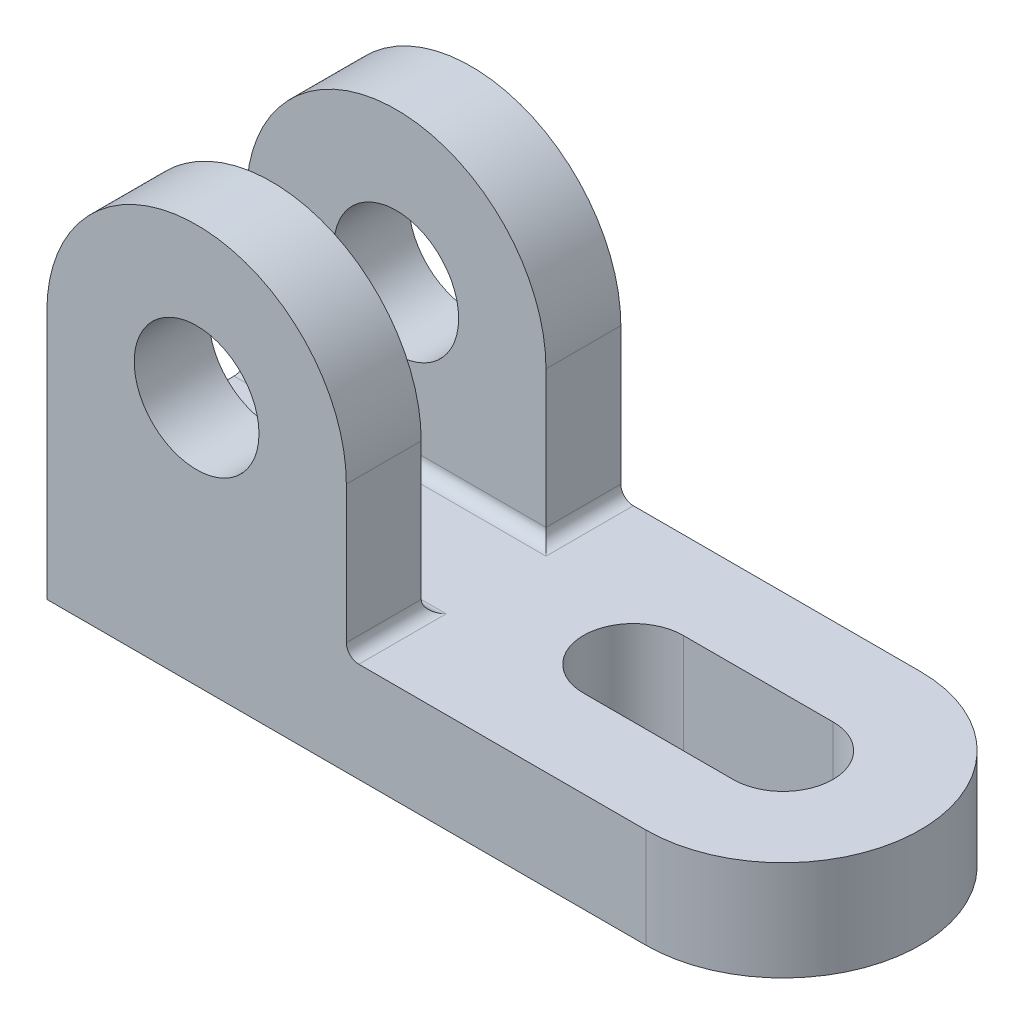
ISO-10303-21;
HEADER;
FILE_DESCRIPTION(('STEP AP214'),'2;1');
FILE_NAME('part.step','',(''),(''),'','','');
FILE_SCHEMA(('AUTOMOTIVE_DESIGN { 1 0 10303 214 1 1 1 1 }'));
ENDSEC;
DATA;
#1=APPLICATION_CONTEXT('core data for automotive mechanical design processes');
#2=APPLICATION_PROTOCOL_DEFINITION('international standard','automotive_design',2000,#1);
#3=PRODUCT_CONTEXT('',#1,'mechanical');
#4=PRODUCT('Part','Part','',(#3));
#5=PRODUCT_RELATED_PRODUCT_CATEGORY('part','',(#4));
#6=PRODUCT_DEFINITION_FORMATION('','',#4);
#7=PRODUCT_DEFINITION_CONTEXT('part definition',#1,'design');
#8=PRODUCT_DEFINITION('design','',#6,#7);
#9=PRODUCT_DEFINITION_SHAPE('','',#8);
#10=(LENGTH_UNIT() NAMED_UNIT(*) SI_UNIT(.MILLI.,.METRE.));
#11=(NAMED_UNIT(*) PLANE_ANGLE_UNIT() SI_UNIT($,.RADIAN.));
#12=(NAMED_UNIT(*) SI_UNIT($,.STERADIAN.) SOLID_ANGLE_UNIT());
#13=UNCERTAINTY_MEASURE_WITH_UNIT(LENGTH_MEASURE(1.E-05),#10,'distance_accuracy_value','');
#14=(GEOMETRIC_REPRESENTATION_CONTEXT(3) GLOBAL_UNCERTAINTY_ASSIGNED_CONTEXT((#13)) GLOBAL_UNIT_ASSIGNED_CONTEXT((#10,
#11,#12)) REPRESENTATION_CONTEXT('',''));
#15=CARTESIAN_POINT('',(0.,0.,0.));
#16=DIRECTION('',(0.,0.,1.));
#17=DIRECTION('',(1.,0.,0.));
#18=AXIS2_PLACEMENT_3D('',#15,#16,#17);
#19=CARTESIAN_POINT('',(0.,16.,0.));
#20=DIRECTION('',(0.,1.,0.));
#21=DIRECTION('',(0.,0.,1.));
#22=AXIS2_PLACEMENT_3D('',#19,#20,#21);
#23=PLANE('',#22);
#24=CARTESIAN_POINT('',(37.,16.,0.));
#25=DIRECTION('',(0.,1.,0.));
#26=DIRECTION('',(0.,0.,1.));
#27=AXIS2_PLACEMENT_3D('',#24,#25,#26);
#28=CIRCLE('',#27,8.);
#29=CARTESIAN_POINT('',(37.,16.,8.));
#30=VERTEX_POINT('',#29);
#31=CARTESIAN_POINT('',(37.,16.,-8.));
#32=VERTEX_POINT('',#31);
#33=EDGE_CURVE('E199',#30,#32,#28,.T.);
#34=ORIENTED_EDGE('',*,*,#33,.F.);
#35=DIRECTION('',(1.,0.,0.));
#36=VECTOR('',#35,1.);
#37=CARTESIAN_POINT('',(37.,16.,8.));
#38=LINE('',#37,#36);
#39=CARTESIAN_POINT('',(13.,16.,8.00000000000001));
#40=VERTEX_POINT('',#39);
#41=EDGE_CURVE('E207',#40,#30,#38,.T.);
#42=ORIENTED_EDGE('',*,*,#41,.F.);
#43=CARTESIAN_POINT('',(13.,16.,0.));
#44=DIRECTION('',(0.,1.,0.));
#45=DIRECTION('',(0.,0.,1.));
#46=AXIS2_PLACEMENT_3D('',#43,#44,#45);
#47=CIRCLE('',#46,8.);
#48=CARTESIAN_POINT('',(13.,16.,-8.));
#49=VERTEX_POINT('',#48);
#50=EDGE_CURVE('E221',#49,#40,#47,.T.);
#51=ORIENTED_EDGE('',*,*,#50,.F.);
#52=DIRECTION('',(-1.,0.,0.));
#53=VECTOR('',#52,1.);
#54=CARTESIAN_POINT('',(37.,16.,-8.));
#55=LINE('',#54,#53);
#56=EDGE_CURVE('E218',#32,#49,#55,.T.);
#57=ORIENTED_EDGE('',*,*,#56,.F.);
#58=EDGE_LOOP('',(#34,#42,#51,#57));
#59=FACE_BOUND('',#58,.T.);
#60=DIRECTION('',(0.,0.,-1.));
#61=VECTOR('',#60,1.);
#62=CARTESIAN_POINT('',(-8.99999999999998,16.,0.));
#63=LINE('',#62,#61);
#64=CARTESIAN_POINT('',(-8.99999999999998,16.,-22.));
#65=VERTEX_POINT('',#64);
#66=CARTESIAN_POINT('',(-8.99999999999998,16.,-8.));
#67=VERTEX_POINT('',#66);
#68=EDGE_CURVE('E246',#65,#67,#63,.F.);
#69=ORIENTED_EDGE('',*,*,#68,.T.);
#70=DIRECTION('',(-1.,0.,0.));
#71=VECTOR('',#70,1.);
#72=CARTESIAN_POINT('',(0.,16.,-8.));
#73=LINE('',#72,#71);
#74=CARTESIAN_POINT('',(-59.,16.,-8.));
#75=VERTEX_POINT('',#74);
#76=EDGE_CURVE('E286',#67,#75,#73,.T.);
#77=ORIENTED_EDGE('',*,*,#76,.T.);
#78=DIRECTION('',(0.,0.,-1.));
#79=VECTOR('',#78,1.);
#80=CARTESIAN_POINT('',(-59.,16.,0.));
#81=LINE('',#80,#79);
#82=CARTESIAN_POINT('',(-59.,16.,8.));
#83=VERTEX_POINT('',#82);
#84=EDGE_CURVE('E265',#83,#75,#81,.T.);
#85=ORIENTED_EDGE('',*,*,#84,.F.);
#86=DIRECTION('',(-1.,0.,0.));
#87=VECTOR('',#86,1.);
#88=CARTESIAN_POINT('',(0.,16.,8.));
#89=LINE('',#88,#87);
#90=CARTESIAN_POINT('',(-8.99999999999998,16.,8.));
#91=VERTEX_POINT('',#90);
#92=EDGE_CURVE('E283',#83,#91,#89,.F.);
#93=ORIENTED_EDGE('',*,*,#92,.T.);
#94=DIRECTION('',(0.,0.,1.));
#95=VECTOR('',#94,1.);
#96=CARTESIAN_POINT('',(-8.99999999999998,16.,22.));
#97=LINE('',#96,#95);
#98=CARTESIAN_POINT('',(-8.99999999999998,16.,22.));
#99=VERTEX_POINT('',#98);
#100=EDGE_CURVE('E248',#91,#99,#97,.T.);
#101=ORIENTED_EDGE('',*,*,#100,.T.);
#102=DIRECTION('',(1.,0.,0.));
#103=VECTOR('',#102,1.);
#104=CARTESIAN_POINT('',(0.,16.,22.));
#105=LINE('',#104,#103);
#106=CARTESIAN_POINT('',(37.,16.,22.));
#107=VERTEX_POINT('',#106);
#108=EDGE_CURVE('E240',#99,#107,#105,.T.);
#109=ORIENTED_EDGE('',*,*,#108,.T.);
#110=CARTESIAN_POINT('',(37.,16.,0.));
#111=DIRECTION('',(0.,1.,0.));
#112=DIRECTION('',(0.,0.,1.));
#113=AXIS2_PLACEMENT_3D('',#110,#111,#112);
#114=CIRCLE('',#113,22.);
#115=CARTESIAN_POINT('',(37.,16.,-22.));
#116=VERTEX_POINT('',#115);
#117=EDGE_CURVE('E237',#107,#116,#114,.T.);
#118=ORIENTED_EDGE('',*,*,#117,.T.);
#119=DIRECTION('',(1.,0.,0.));
#120=VECTOR('',#119,1.);
#121=CARTESIAN_POINT('',(0.,16.,-22.));
#122=LINE('',#121,#120);
#123=EDGE_CURVE('E277',#65,#116,#122,.T.);
#124=ORIENTED_EDGE('',*,*,#123,.F.);
#125=EDGE_LOOP('',(#69,#77,#85,#93,#101,#109,#118,#124));
#126=FACE_BOUND('',#125,.T.);
#127=ADVANCED_FACE('F35',(#59,#126),#23,.T.);
#128=CARTESIAN_POINT('',(0.,16.,22.));
#129=DIRECTION('',(0.,0.,-1.));
#130=DIRECTION('',(-1.,0.,0.));
#131=AXIS2_PLACEMENT_3D('',#128,#129,#130);
#132=PLANE('',#131);
#133=DIRECTION('',(1.,0.,0.));
#134=VECTOR('',#133,1.);
#135=CARTESIAN_POINT('',(0.,0.,22.));
#136=LINE('',#135,#134);
#137=CARTESIAN_POINT('',(-59.,0.,22.));
#138=VERTEX_POINT('',#137);
#139=CARTESIAN_POINT('',(37.,0.,22.));
#140=VERTEX_POINT('',#139);
#141=EDGE_CURVE('E228',#138,#140,#136,.T.);
#142=ORIENTED_EDGE('',*,*,#141,.T.);
#143=DIRECTION('',(0.,-1.,0.));
#144=VECTOR('',#143,1.);
#145=CARTESIAN_POINT('',(37.,16.,22.));
#146=LINE('',#145,#144);
#147=EDGE_CURVE('E249',#107,#140,#146,.T.);
#148=ORIENTED_EDGE('',*,*,#147,.F.);
#149=ORIENTED_EDGE('',*,*,#108,.F.);
#150=CARTESIAN_POINT('',(-8.99999999999998,18.,22.));
#151=DIRECTION('',(0.,0.,-1.));
#152=DIRECTION('',(-1.,0.,0.));
#153=AXIS2_PLACEMENT_3D('',#150,#151,#152);
#154=CIRCLE('',#153,2.);
#155=CARTESIAN_POINT('',(-11.,18.,22.));
#156=VERTEX_POINT('',#155);
#157=EDGE_CURVE('E324',#99,#156,#154,.T.);
#158=ORIENTED_EDGE('',*,*,#157,.T.);
#159=DIRECTION('',(0.,1.,0.));
#160=VECTOR('',#159,1.);
#161=CARTESIAN_POINT('',(-11.,0.,22.));
#162=LINE('',#161,#160);
#163=CARTESIAN_POINT('',(-11.,40.,22.));
#164=VERTEX_POINT('',#163);
#165=EDGE_CURVE('E193',#156,#164,#162,.T.);
#166=ORIENTED_EDGE('',*,*,#165,.T.);
#167=CARTESIAN_POINT('',(-35.,40.,22.));
#168=DIRECTION('',(0.,0.,1.));
#169=DIRECTION('',(1.,0.,0.));
#170=AXIS2_PLACEMENT_3D('',#167,#168,#169);
#171=CIRCLE('',#170,24.);
#172=CARTESIAN_POINT('',(-59.,40.,22.));
#173=VERTEX_POINT('',#172);
#174=EDGE_CURVE('E185',#164,#173,#171,.T.);
#175=ORIENTED_EDGE('',*,*,#174,.T.);
#176=DIRECTION('',(0.,-1.,0.));
#177=VECTOR('',#176,1.);
#178=CARTESIAN_POINT('',(-59.,16.,22.));
#179=LINE('',#178,#177);
#180=EDGE_CURVE('E263',#173,#138,#179,.T.);
#181=ORIENTED_EDGE('',*,*,#180,.T.);
#182=EDGE_LOOP('',(#142,#148,#149,#158,#166,#175,#181));
#183=FACE_BOUND('',#182,.T.);
#184=CARTESIAN_POINT('',(-35.,40.,22.));
#185=DIRECTION('',(0.,0.,1.));
#186=DIRECTION('',(1.,0.,0.));
#187=AXIS2_PLACEMENT_3D('',#184,#185,#186);
#188=CIRCLE('',#187,10.);
#189=CARTESIAN_POINT('',(-25.,40.,22.));
#190=VERTEX_POINT('',#189);
#191=EDGE_CURVE('E176',#190,#190,#188,.T.);
#192=ORIENTED_EDGE('',*,*,#191,.F.);
#193=EDGE_LOOP('',(#192));
#194=FACE_BOUND('',#193,.T.);
#195=ADVANCED_FACE('F320',(#183,#194),#132,.F.);
#196=CARTESIAN_POINT('',(37.,16.,0.));
#197=DIRECTION('',(0.,-1.,0.));
#198=DIRECTION('',(0.,0.,-1.));
#199=AXIS2_PLACEMENT_3D('',#196,#197,#198);
#200=CYLINDRICAL_SURFACE('',#199,22.);
#201=CARTESIAN_POINT('',(37.,0.,0.));
#202=DIRECTION('',(0.,1.,0.));
#203=DIRECTION('',(0.,0.,1.));
#204=AXIS2_PLACEMENT_3D('',#201,#202,#203);
#205=CIRCLE('',#204,22.);
#206=CARTESIAN_POINT('',(37.,0.,-22.));
#207=VERTEX_POINT('',#206);
#208=EDGE_CURVE('E271',#140,#207,#205,.T.);
#209=ORIENTED_EDGE('',*,*,#208,.T.);
#210=DIRECTION('',(0.,-1.,0.));
#211=VECTOR('',#210,1.);
#212=CARTESIAN_POINT('',(37.,16.,-22.));
#213=LINE('',#212,#211);
#214=EDGE_CURVE('E259',#116,#207,#213,.T.);
#215=ORIENTED_EDGE('',*,*,#214,.F.);
#216=ORIENTED_EDGE('',*,*,#117,.F.);
#217=ORIENTED_EDGE('',*,*,#147,.T.);
#218=EDGE_LOOP('',(#209,#215,#216,#217));
#219=FACE_BOUND('',#218,.T.);
#220=ADVANCED_FACE('F365',(#219),#200,.T.);
#221=CARTESIAN_POINT('',(0.,16.,-22.));
#222=DIRECTION('',(0.,0.,-1.));
#223=DIRECTION('',(-1.,0.,0.));
#224=AXIS2_PLACEMENT_3D('',#221,#222,#223);
#225=PLANE('',#224);
#226=DIRECTION('',(1.,0.,0.));
#227=VECTOR('',#226,1.);
#228=CARTESIAN_POINT('',(0.,0.,-22.));
#229=LINE('',#228,#227);
#230=CARTESIAN_POINT('',(-59.,0.,-22.));
#231=VERTEX_POINT('',#230);
#232=EDGE_CURVE('E268',#231,#207,#229,.T.);
#233=ORIENTED_EDGE('',*,*,#232,.F.);
#234=DIRECTION('',(0.,-1.,0.));
#235=VECTOR('',#234,1.);
#236=CARTESIAN_POINT('',(-59.,16.,-22.));
#237=LINE('',#236,#235);
#238=CARTESIAN_POINT('',(-59.,40.,-22.));
#239=VERTEX_POINT('',#238);
#240=EDGE_CURVE('E261',#239,#231,#237,.T.);
#241=ORIENTED_EDGE('',*,*,#240,.F.);
#242=CARTESIAN_POINT('',(-35.,40.,-22.));
#243=DIRECTION('',(0.,0.,1.));
#244=DIRECTION('',(1.,0.,0.));
#245=AXIS2_PLACEMENT_3D('',#242,#243,#244);
#246=CIRCLE('',#245,24.);
#247=CARTESIAN_POINT('',(-11.,40.,-22.));
#248=VERTEX_POINT('',#247);
#249=EDGE_CURVE('E173',#248,#239,#246,.T.);
#250=ORIENTED_EDGE('',*,*,#249,.F.);
#251=DIRECTION('',(0.,1.,0.));
#252=VECTOR('',#251,1.);
#253=CARTESIAN_POINT('',(-11.,0.,-22.));
#254=LINE('',#253,#252);
#255=CARTESIAN_POINT('',(-11.,18.,-22.));
#256=VERTEX_POINT('',#255);
#257=EDGE_CURVE('E331',#256,#248,#254,.T.);
#258=ORIENTED_EDGE('',*,*,#257,.F.);
#259=CARTESIAN_POINT('',(-8.99999999999998,18.,-22.));
#260=DIRECTION('',(0.,0.,-1.));
#261=DIRECTION('',(-1.,0.,0.));
#262=AXIS2_PLACEMENT_3D('',#259,#260,#261);
#263=CIRCLE('',#262,2.);
#264=EDGE_CURVE('E281',#256,#65,#263,.F.);
#265=ORIENTED_EDGE('',*,*,#264,.T.);
#266=ORIENTED_EDGE('',*,*,#123,.T.);
#267=ORIENTED_EDGE('',*,*,#214,.T.);
#268=EDGE_LOOP('',(#233,#241,#250,#258,#265,#266,#267));
#269=FACE_BOUND('',#268,.T.);
#270=CARTESIAN_POINT('',(-35.,40.,-22.));
#271=DIRECTION('',(0.,0.,1.));
#272=DIRECTION('',(1.,0.,0.));
#273=AXIS2_PLACEMENT_3D('',#270,#271,#272);
#274=CIRCLE('',#273,10.);
#275=CARTESIAN_POINT('',(-25.,40.,-22.));
#276=VERTEX_POINT('',#275);
#277=EDGE_CURVE('E341',#276,#276,#274,.T.);
#278=ORIENTED_EDGE('',*,*,#277,.T.);
#279=EDGE_LOOP('',(#278));
#280=FACE_BOUND('',#279,.T.);
#281=ADVANCED_FACE('F336',(#269,#280),#225,.T.);
#282=CARTESIAN_POINT('',(-59.,16.,0.));
#283=DIRECTION('',(-1.,0.,0.));
#284=DIRECTION('',(0.,0.,1.));
#285=AXIS2_PLACEMENT_3D('',#282,#283,#284);
#286=PLANE('',#285);
#287=DIRECTION('',(0.,0.,-1.));
#288=VECTOR('',#287,1.);
#289=CARTESIAN_POINT('',(-59.,0.,0.));
#290=LINE('',#289,#288);
#291=EDGE_CURVE('E243',#138,#231,#290,.T.);
#292=ORIENTED_EDGE('',*,*,#291,.F.);
#293=ORIENTED_EDGE('',*,*,#180,.F.);
#294=DIRECTION('',(0.,0.,1.));
#295=VECTOR('',#294,1.);
#296=CARTESIAN_POINT('',(-59.,40.,10.));
#297=LINE('',#296,#295);
#298=CARTESIAN_POINT('',(-59.,40.,10.));
#299=VERTEX_POINT('',#298);
#300=EDGE_CURVE('E196',#299,#173,#297,.T.);
#301=ORIENTED_EDGE('',*,*,#300,.F.);
#302=DIRECTION('',(0.,1.,0.));
#303=VECTOR('',#302,1.);
#304=CARTESIAN_POINT('',(-59.,0.,10.));
#305=LINE('',#304,#303);
#306=CARTESIAN_POINT('',(-59.,18.,10.));
#307=VERTEX_POINT('',#306);
#308=EDGE_CURVE('E190',#307,#299,#305,.T.);
#309=ORIENTED_EDGE('',*,*,#308,.F.);
#310=CARTESIAN_POINT('',(-59.,18.,8.));
#311=DIRECTION('',(-1.,0.,0.));
#312=DIRECTION('',(0.,0.,1.));
#313=AXIS2_PLACEMENT_3D('',#310,#311,#312);
#314=CIRCLE('',#313,2.);
#315=EDGE_CURVE('E43',#307,#83,#314,.F.);
#316=ORIENTED_EDGE('',*,*,#315,.T.);
#317=ORIENTED_EDGE('',*,*,#84,.T.);
#318=CARTESIAN_POINT('',(-59.,18.,-8.));
#319=DIRECTION('',(-1.,0.,0.));
#320=DIRECTION('',(0.,0.,1.));
#321=AXIS2_PLACEMENT_3D('',#318,#319,#320);
#322=CIRCLE('',#321,2.);
#323=CARTESIAN_POINT('',(-59.,18.,-10.));
#324=VERTEX_POINT('',#323);
#325=EDGE_CURVE('E57',#75,#324,#322,.F.);
#326=ORIENTED_EDGE('',*,*,#325,.T.);
#327=DIRECTION('',(0.,1.,0.));
#328=VECTOR('',#327,1.);
#329=CARTESIAN_POINT('',(-59.,0.,-10.));
#330=LINE('',#329,#328);
#331=CARTESIAN_POINT('',(-59.,40.,-10.));
#332=VERTEX_POINT('',#331);
#333=EDGE_CURVE('E151',#324,#332,#330,.T.);
#334=ORIENTED_EDGE('',*,*,#333,.T.);
#335=DIRECTION('',(0.,0.,-1.));
#336=VECTOR('',#335,1.);
#337=CARTESIAN_POINT('',(-59.,40.,-10.));
#338=LINE('',#337,#336);
#339=EDGE_CURVE('E156',#332,#239,#338,.T.);
#340=ORIENTED_EDGE('',*,*,#339,.T.);
#341=ORIENTED_EDGE('',*,*,#240,.T.);
#342=EDGE_LOOP('',(#292,#293,#301,#309,#316,#317,#326,#334,#340,#341));
#343=FACE_BOUND('',#342,.T.);
#344=ADVANCED_FACE('F154',(#343),#286,.T.);
#345=CARTESIAN_POINT('',(0.,0.,0.));
#346=DIRECTION('',(0.,1.,0.));
#347=DIRECTION('',(0.,0.,1.));
#348=AXIS2_PLACEMENT_3D('',#345,#346,#347);
#349=PLANE('',#348);
#350=DIRECTION('',(1.,0.,0.));
#351=VECTOR('',#350,1.);
#352=CARTESIAN_POINT('',(37.,0.,8.));
#353=LINE('',#352,#351);
#354=CARTESIAN_POINT('',(13.,0.,8.00000000000001));
#355=VERTEX_POINT('',#354);
#356=CARTESIAN_POINT('',(37.,0.,8.));
#357=VERTEX_POINT('',#356);
#358=EDGE_CURVE('E213',#355,#357,#353,.T.);
#359=ORIENTED_EDGE('',*,*,#358,.T.);
#360=CARTESIAN_POINT('',(37.,0.,0.));
#361=DIRECTION('',(0.,1.,0.));
#362=DIRECTION('',(0.,0.,1.));
#363=AXIS2_PLACEMENT_3D('',#360,#361,#362);
#364=CIRCLE('',#363,8.);
#365=CARTESIAN_POINT('',(37.,0.,-8.));
#366=VERTEX_POINT('',#365);
#367=EDGE_CURVE('E203',#357,#366,#364,.T.);
#368=ORIENTED_EDGE('',*,*,#367,.T.);
#369=DIRECTION('',(-1.,0.,0.));
#370=VECTOR('',#369,1.);
#371=CARTESIAN_POINT('',(37.,0.,-8.));
#372=LINE('',#371,#370);
#373=CARTESIAN_POINT('',(13.,0.,-8.));
#374=VERTEX_POINT('',#373);
#375=EDGE_CURVE('E206',#366,#374,#372,.T.);
#376=ORIENTED_EDGE('',*,*,#375,.T.);
#377=CARTESIAN_POINT('',(13.,0.,0.));
#378=DIRECTION('',(0.,1.,0.));
#379=DIRECTION('',(0.,0.,1.));
#380=AXIS2_PLACEMENT_3D('',#377,#378,#379);
#381=CIRCLE('',#380,8.);
#382=EDGE_CURVE('E210',#374,#355,#381,.T.);
#383=ORIENTED_EDGE('',*,*,#382,.T.);
#384=EDGE_LOOP('',(#359,#368,#376,#383));
#385=FACE_BOUND('',#384,.T.);
#386=ORIENTED_EDGE('',*,*,#141,.F.);
#387=ORIENTED_EDGE('',*,*,#291,.T.);
#388=ORIENTED_EDGE('',*,*,#232,.T.);
#389=ORIENTED_EDGE('',*,*,#208,.F.);
#390=EDGE_LOOP('',(#386,#387,#388,#389));
#391=FACE_BOUND('',#390,.T.);
#392=ADVANCED_FACE('F372',(#385,#391),#349,.F.);
#393=CARTESIAN_POINT('',(37.,0.,0.));
#394=DIRECTION('',(0.,1.,0.));
#395=DIRECTION('',(0.,0.,1.));
#396=AXIS2_PLACEMENT_3D('',#393,#394,#395);
#397=CYLINDRICAL_SURFACE('',#396,8.);
#398=ORIENTED_EDGE('',*,*,#33,.T.);
#399=DIRECTION('',(0.,1.,0.));
#400=VECTOR('',#399,1.);
#401=CARTESIAN_POINT('',(37.,0.,-8.));
#402=LINE('',#401,#400);
#403=EDGE_CURVE('E216',#366,#32,#402,.T.);
#404=ORIENTED_EDGE('',*,*,#403,.F.);
#405=ORIENTED_EDGE('',*,*,#367,.F.);
#406=DIRECTION('',(0.,1.,0.));
#407=VECTOR('',#406,1.);
#408=CARTESIAN_POINT('',(37.,0.,8.));
#409=LINE('',#408,#407);
#410=EDGE_CURVE('E226',#357,#30,#409,.T.);
#411=ORIENTED_EDGE('',*,*,#410,.T.);
#412=EDGE_LOOP('',(#398,#404,#405,#411));
#413=FACE_BOUND('',#412,.T.);
#414=ADVANCED_FACE('F370',(#413),#397,.F.);
#415=CARTESIAN_POINT('',(37.,0.,8.));
#416=DIRECTION('',(0.,0.,1.));
#417=DIRECTION('',(1.,0.,0.));
#418=AXIS2_PLACEMENT_3D('',#415,#416,#417);
#419=PLANE('',#418);
#420=ORIENTED_EDGE('',*,*,#41,.T.);
#421=ORIENTED_EDGE('',*,*,#410,.F.);
#422=ORIENTED_EDGE('',*,*,#358,.F.);
#423=DIRECTION('',(0.,1.,0.));
#424=VECTOR('',#423,1.);
#425=CARTESIAN_POINT('',(13.,0.,8.00000000000001));
#426=LINE('',#425,#424);
#427=EDGE_CURVE('E229',#355,#40,#426,.T.);
#428=ORIENTED_EDGE('',*,*,#427,.T.);
#429=EDGE_LOOP('',(#420,#421,#422,#428));
#430=FACE_BOUND('',#429,.T.);
#431=ADVANCED_FACE('F525',(#430),#419,.F.);
#432=CARTESIAN_POINT('',(13.,0.,0.));
#433=DIRECTION('',(0.,1.,0.));
#434=DIRECTION('',(0.,0.,1.));
#435=AXIS2_PLACEMENT_3D('',#432,#433,#434);
#436=CYLINDRICAL_SURFACE('',#435,8.);
#437=ORIENTED_EDGE('',*,*,#50,.T.);
#438=ORIENTED_EDGE('',*,*,#427,.F.);
#439=ORIENTED_EDGE('',*,*,#382,.F.);
#440=DIRECTION('',(0.,1.,0.));
#441=VECTOR('',#440,1.);
#442=CARTESIAN_POINT('',(13.,0.,-8.));
#443=LINE('',#442,#441);
#444=EDGE_CURVE('E231',#374,#49,#443,.T.);
#445=ORIENTED_EDGE('',*,*,#444,.T.);
#446=EDGE_LOOP('',(#437,#438,#439,#445));
#447=FACE_BOUND('',#446,.T.);
#448=ADVANCED_FACE('F515',(#447),#436,.F.);
#449=CARTESIAN_POINT('',(37.,0.,-8.));
#450=DIRECTION('',(0.,0.,-1.));
#451=DIRECTION('',(-1.,0.,0.));
#452=AXIS2_PLACEMENT_3D('',#449,#450,#451);
#453=PLANE('',#452);
#454=ORIENTED_EDGE('',*,*,#56,.T.);
#455=ORIENTED_EDGE('',*,*,#444,.F.);
#456=ORIENTED_EDGE('',*,*,#375,.F.);
#457=ORIENTED_EDGE('',*,*,#403,.T.);
#458=EDGE_LOOP('',(#454,#455,#456,#457));
#459=FACE_BOUND('',#458,.T.);
#460=ADVANCED_FACE('F506',(#459),#453,.F.);
#461=CARTESIAN_POINT('',(-35.,40.,10.));
#462=DIRECTION('',(0.,0.,1.));
#463=DIRECTION('',(1.,0.,0.));
#464=AXIS2_PLACEMENT_3D('',#461,#462,#463);
#465=CYLINDRICAL_SURFACE('',#464,24.);
#466=ORIENTED_EDGE('',*,*,#174,.F.);
#467=DIRECTION('',(0.,0.,1.));
#468=VECTOR('',#467,1.);
#469=CARTESIAN_POINT('',(-11.,40.,10.));
#470=LINE('',#469,#468);
#471=CARTESIAN_POINT('',(-11.,40.,10.));
#472=VERTEX_POINT('',#471);
#473=EDGE_CURVE('E200',#472,#164,#470,.T.);
#474=ORIENTED_EDGE('',*,*,#473,.F.);
#475=CARTESIAN_POINT('',(-35.,40.,10.));
#476=DIRECTION('',(0.,0.,1.));
#477=DIRECTION('',(1.,0.,0.));
#478=AXIS2_PLACEMENT_3D('',#475,#476,#477);
#479=CIRCLE('',#478,24.);
#480=EDGE_CURVE('E187',#472,#299,#479,.T.);
#481=ORIENTED_EDGE('',*,*,#480,.T.);
#482=ORIENTED_EDGE('',*,*,#300,.T.);
#483=EDGE_LOOP('',(#466,#474,#481,#482));
#484=FACE_BOUND('',#483,.T.);
#485=ADVANCED_FACE('F318',(#484),#465,.T.);
#486=CARTESIAN_POINT('',(-35.,40.,10.));
#487=DIRECTION('',(0.,0.,1.));
#488=DIRECTION('',(1.,0.,0.));
#489=AXIS2_PLACEMENT_3D('',#486,#487,#488);
#490=CYLINDRICAL_SURFACE('',#489,10.);
#491=CARTESIAN_POINT('',(-35.,40.,10.));
#492=DIRECTION('',(0.,0.,1.));
#493=DIRECTION('',(1.,0.,0.));
#494=AXIS2_PLACEMENT_3D('',#491,#492,#493);
#495=CIRCLE('',#494,10.);
#496=CARTESIAN_POINT('',(-25.,40.,10.));
#497=VERTEX_POINT('',#496);
#498=EDGE_CURVE('E181',#497,#497,#495,.T.);
#499=ORIENTED_EDGE('',*,*,#498,.F.);
#500=EDGE_LOOP('',(#499));
#501=FACE_BOUND('',#500,.T.);
#502=ORIENTED_EDGE('',*,*,#191,.T.);
#503=EDGE_LOOP('',(#502));
#504=FACE_BOUND('',#503,.T.);
#505=ADVANCED_FACE('F452',(#501,#504),#490,.F.);
#506=CARTESIAN_POINT('',(-11.,0.,10.));
#507=DIRECTION('',(1.,0.,0.));
#508=DIRECTION('',(0.,0.,-1.));
#509=AXIS2_PLACEMENT_3D('',#506,#507,#508);
#510=PLANE('',#509);
#511=ORIENTED_EDGE('',*,*,#165,.F.);
#512=DIRECTION('',(0.,0.,1.));
#513=VECTOR('',#512,1.);
#514=CARTESIAN_POINT('',(-11.,18.,10.));
#515=LINE('',#514,#513);
#516=CARTESIAN_POINT('',(-11.,18.,10.));
#517=VERTEX_POINT('',#516);
#518=EDGE_CURVE('E252',#156,#517,#515,.F.);
#519=ORIENTED_EDGE('',*,*,#518,.T.);
#520=DIRECTION('',(0.,1.,0.));
#521=VECTOR('',#520,1.);
#522=CARTESIAN_POINT('',(-11.,0.,10.));
#523=LINE('',#522,#521);
#524=EDGE_CURVE('E184',#517,#472,#523,.T.);
#525=ORIENTED_EDGE('',*,*,#524,.T.);
#526=ORIENTED_EDGE('',*,*,#473,.T.);
#527=EDGE_LOOP('',(#511,#519,#525,#526));
#528=FACE_BOUND('',#527,.T.);
#529=ADVANCED_FACE('F310',(#528),#510,.T.);
#530=CARTESIAN_POINT('',(0.,0.,10.));
#531=DIRECTION('',(0.,0.,1.));
#532=DIRECTION('',(1.,0.,0.));
#533=AXIS2_PLACEMENT_3D('',#530,#531,#532);
#534=PLANE('',#533);
#535=ORIENTED_EDGE('',*,*,#498,.T.);
#536=EDGE_LOOP('',(#535));
#537=FACE_BOUND('',#536,.T.);
#538=ORIENTED_EDGE('',*,*,#524,.F.);
#539=DIRECTION('',(-1.,0.,0.));
#540=VECTOR('',#539,1.);
#541=CARTESIAN_POINT('',(0.,18.,10.));
#542=LINE('',#541,#540);
#543=EDGE_CURVE('E291',#517,#307,#542,.T.);
#544=ORIENTED_EDGE('',*,*,#543,.T.);
#545=ORIENTED_EDGE('',*,*,#308,.T.);
#546=ORIENTED_EDGE('',*,*,#480,.F.);
#547=EDGE_LOOP('',(#538,#544,#545,#546));
#548=FACE_BOUND('',#547,.T.);
#549=ADVANCED_FACE('F315',(#537,#548),#534,.F.);
#550=CARTESIAN_POINT('',(-11.,0.,-10.));
#551=DIRECTION('',(-1.,0.,0.));
#552=DIRECTION('',(0.,0.,1.));
#553=AXIS2_PLACEMENT_3D('',#550,#551,#552);
#554=PLANE('',#553);
#555=DIRECTION('',(0.,1.,0.));
#556=VECTOR('',#555,1.);
#557=CARTESIAN_POINT('',(-11.,0.,-10.));
#558=LINE('',#557,#556);
#559=CARTESIAN_POINT('',(-11.,18.,-10.));
#560=VERTEX_POINT('',#559);
#561=CARTESIAN_POINT('',(-11.,40.,-10.));
#562=VERTEX_POINT('',#561);
#563=EDGE_CURVE('E166',#560,#562,#558,.T.);
#564=ORIENTED_EDGE('',*,*,#563,.F.);
#565=DIRECTION('',(0.,0.,-1.));
#566=VECTOR('',#565,1.);
#567=CARTESIAN_POINT('',(-11.,18.,-10.));
#568=LINE('',#567,#566);
#569=EDGE_CURVE('E312',#560,#256,#568,.T.);
#570=ORIENTED_EDGE('',*,*,#569,.T.);
#571=ORIENTED_EDGE('',*,*,#257,.T.);
#572=DIRECTION('',(0.,0.,-1.));
#573=VECTOR('',#572,1.);
#574=CARTESIAN_POINT('',(-11.,40.,-10.));
#575=LINE('',#574,#573);
#576=EDGE_CURVE('E174',#562,#248,#575,.T.);
#577=ORIENTED_EDGE('',*,*,#576,.F.);
#578=EDGE_LOOP('',(#564,#570,#571,#577));
#579=FACE_BOUND('',#578,.T.);
#580=ADVANCED_FACE('F330',(#579),#554,.F.);
#581=CARTESIAN_POINT('',(-35.,40.,-10.));
#582=DIRECTION('',(0.,0.,-1.));
#583=DIRECTION('',(-1.,0.,0.));
#584=AXIS2_PLACEMENT_3D('',#581,#582,#583);
#585=CYLINDRICAL_SURFACE('',#584,24.);
#586=ORIENTED_EDGE('',*,*,#249,.T.);
#587=ORIENTED_EDGE('',*,*,#339,.F.);
#588=CARTESIAN_POINT('',(-35.,40.,-10.));
#589=DIRECTION('',(0.,0.,1.));
#590=DIRECTION('',(1.,0.,0.));
#591=AXIS2_PLACEMENT_3D('',#588,#589,#590);
#592=CIRCLE('',#591,24.);
#593=EDGE_CURVE('E160',#562,#332,#592,.T.);
#594=ORIENTED_EDGE('',*,*,#593,.F.);
#595=ORIENTED_EDGE('',*,*,#576,.T.);
#596=EDGE_LOOP('',(#586,#587,#594,#595));
#597=FACE_BOUND('',#596,.T.);
#598=ADVANCED_FACE('F171',(#597),#585,.T.);
#599=CARTESIAN_POINT('',(-35.,40.,-10.));
#600=DIRECTION('',(0.,0.,-1.));
#601=DIRECTION('',(-1.,0.,0.));
#602=AXIS2_PLACEMENT_3D('',#599,#600,#601);
#603=CYLINDRICAL_SURFACE('',#602,10.);
#604=CARTESIAN_POINT('',(-35.,40.,-10.));
#605=DIRECTION('',(0.,0.,1.));
#606=DIRECTION('',(1.,0.,0.));
#607=AXIS2_PLACEMENT_3D('',#604,#605,#606);
#608=CIRCLE('',#607,10.);
#609=CARTESIAN_POINT('',(-25.,40.,-10.));
#610=VERTEX_POINT('',#609);
#611=EDGE_CURVE('E161',#610,#610,#608,.T.);
#612=ORIENTED_EDGE('',*,*,#611,.T.);
#613=EDGE_LOOP('',(#612));
#614=FACE_BOUND('',#613,.T.);
#615=ORIENTED_EDGE('',*,*,#277,.F.);
#616=EDGE_LOOP('',(#615));
#617=FACE_BOUND('',#616,.T.);
#618=ADVANCED_FACE('F347',(#614,#617),#603,.F.);
#619=CARTESIAN_POINT('',(0.,0.,-10.));
#620=DIRECTION('',(0.,0.,-1.));
#621=DIRECTION('',(1.,0.,0.));
#622=AXIS2_PLACEMENT_3D('',#619,#620,#621);
#623=PLANE('',#622);
#624=ORIENTED_EDGE('',*,*,#611,.F.);
#625=EDGE_LOOP('',(#624));
#626=FACE_BOUND('',#625,.T.);
#627=ORIENTED_EDGE('',*,*,#333,.F.);
#628=DIRECTION('',(-1.,0.,0.));
#629=VECTOR('',#628,1.);
#630=CARTESIAN_POINT('',(0.,18.,-10.));
#631=LINE('',#630,#629);
#632=EDGE_CURVE('E289',#324,#560,#631,.F.);
#633=ORIENTED_EDGE('',*,*,#632,.T.);
#634=ORIENTED_EDGE('',*,*,#563,.T.);
#635=ORIENTED_EDGE('',*,*,#593,.T.);
#636=EDGE_LOOP('',(#627,#633,#634,#635));
#637=FACE_BOUND('',#636,.T.);
#638=ADVANCED_FACE('F164',(#626,#637),#623,.F.);
#639=CARTESIAN_POINT('',(-8.99999999999998,18.,0.));
#640=DIRECTION('',(0.,0.,-1.));
#641=DIRECTION('',(-1.,0.,0.));
#642=AXIS2_PLACEMENT_3D('',#639,#640,#641);
#643=CYLINDRICAL_SURFACE('',#642,2.);
#644=ORIENTED_EDGE('',*,*,#100,.F.);
#645=CARTESIAN_POINT('',(-8.99999999999998,18.,8.));
#646=DIRECTION('',(-0.707106781186547,0.,-0.707106781186547));
#647=DIRECTION('',(0.707106781186547,0.,-0.707106781186547));
#648=AXIS2_PLACEMENT_3D('',#645,#646,#647);
#649=ELLIPSE('',#648,2.82842712474619,2.);
#650=EDGE_CURVE('E11',#91,#517,#649,.T.);
#651=ORIENTED_EDGE('',*,*,#650,.T.);
#652=ORIENTED_EDGE('',*,*,#518,.F.);
#653=ORIENTED_EDGE('',*,*,#157,.F.);
#654=EDGE_LOOP('',(#644,#651,#652,#653));
#655=FACE_BOUND('',#654,.T.);
#656=ADVANCED_FACE('F306',(#655),#643,.F.);
#657=CARTESIAN_POINT('',(-8.99999999999998,18.,-10.));
#658=DIRECTION('',(0.,0.,-1.));
#659=DIRECTION('',(-1.,0.,0.));
#660=AXIS2_PLACEMENT_3D('',#657,#658,#659);
#661=CYLINDRICAL_SURFACE('',#660,2.);
#662=ORIENTED_EDGE('',*,*,#569,.F.);
#663=CARTESIAN_POINT('',(-8.99999999999998,18.,-8.));
#664=DIRECTION('',(0.707106781186547,0.,-0.707106781186547));
#665=DIRECTION('',(-0.707106781186547,0.,-0.707106781186547));
#666=AXIS2_PLACEMENT_3D('',#663,#664,#665);
#667=ELLIPSE('',#666,2.82842712474619,2.);
#668=EDGE_CURVE('E295',#560,#67,#667,.F.);
#669=ORIENTED_EDGE('',*,*,#668,.T.);
#670=ORIENTED_EDGE('',*,*,#68,.F.);
#671=ORIENTED_EDGE('',*,*,#264,.F.);
#672=EDGE_LOOP('',(#662,#669,#670,#671));
#673=FACE_BOUND('',#672,.T.);
#674=ADVANCED_FACE('F385',(#673),#661,.F.);
#675=CARTESIAN_POINT('',(0.,18.,-8.));
#676=DIRECTION('',(-1.,0.,0.));
#677=DIRECTION('',(0.,0.,1.));
#678=AXIS2_PLACEMENT_3D('',#675,#676,#677);
#679=CYLINDRICAL_SURFACE('',#678,2.);
#680=ORIENTED_EDGE('',*,*,#668,.F.);
#681=ORIENTED_EDGE('',*,*,#632,.F.);
#682=ORIENTED_EDGE('',*,*,#325,.F.);
#683=ORIENTED_EDGE('',*,*,#76,.F.);
#684=EDGE_LOOP('',(#680,#681,#682,#683));
#685=FACE_BOUND('',#684,.T.);
#686=ADVANCED_FACE('F387',(#685),#679,.F.);
#687=CARTESIAN_POINT('',(0.,18.,8.));
#688=DIRECTION('',(-1.,0.,0.));
#689=DIRECTION('',(0.,0.,1.));
#690=AXIS2_PLACEMENT_3D('',#687,#688,#689);
#691=CYLINDRICAL_SURFACE('',#690,2.);
#692=ORIENTED_EDGE('',*,*,#650,.F.);
#693=ORIENTED_EDGE('',*,*,#92,.F.);
#694=ORIENTED_EDGE('',*,*,#315,.F.);
#695=ORIENTED_EDGE('',*,*,#543,.F.);
#696=EDGE_LOOP('',(#692,#693,#694,#695));
#697=FACE_BOUND('',#696,.T.);
#698=ADVANCED_FACE('F37',(#697),#691,.F.);
#699=CLOSED_SHELL('',(#127,#195,#220,#281,#344,#392,#414,#431,#448,#460,#485,#505,#529,#549,
#580,#598,#618,#638,#656,#674,#686,#698));
#700=MANIFOLD_SOLID_BREP('B2',#699);
#701=ADVANCED_BREP_SHAPE_REPRESENTATION('',(#18,#700),#14);
#702=SHAPE_DEFINITION_REPRESENTATION(#9,#701);
ENDSEC;
END-ISO-10303-21;
